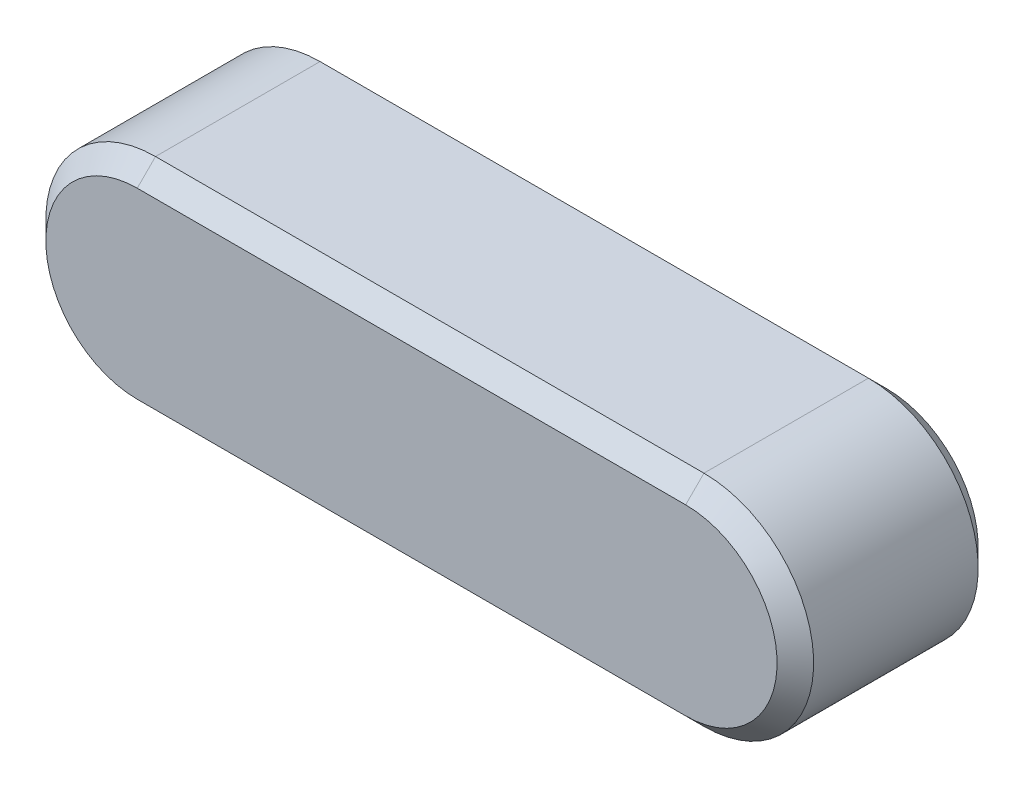
ISO-10303-21;
HEADER;
FILE_DESCRIPTION(('STEP AP214'),'2;1');
FILE_NAME('part.step','',(''),(''),'','','');
FILE_SCHEMA(('AUTOMOTIVE_DESIGN { 1 0 10303 214 1 1 1 1 }'));
ENDSEC;
DATA;
#1=APPLICATION_CONTEXT('core data for automotive mechanical design processes');
#2=APPLICATION_PROTOCOL_DEFINITION('international standard','automotive_design',2000,#1);
#3=PRODUCT_CONTEXT('',#1,'mechanical');
#4=PRODUCT('Part','Part','',(#3));
#5=PRODUCT_RELATED_PRODUCT_CATEGORY('part','',(#4));
#6=PRODUCT_DEFINITION_FORMATION('','',#4);
#7=PRODUCT_DEFINITION_CONTEXT('part definition',#1,'design');
#8=PRODUCT_DEFINITION('design','',#6,#7);
#9=PRODUCT_DEFINITION_SHAPE('','',#8);
#10=(LENGTH_UNIT() NAMED_UNIT(*) SI_UNIT(.MILLI.,.METRE.));
#11=(NAMED_UNIT(*) PLANE_ANGLE_UNIT() SI_UNIT($,.RADIAN.));
#12=(NAMED_UNIT(*) SI_UNIT($,.STERADIAN.) SOLID_ANGLE_UNIT());
#13=UNCERTAINTY_MEASURE_WITH_UNIT(LENGTH_MEASURE(1.E-05),#10,'distance_accuracy_value','');
#14=(GEOMETRIC_REPRESENTATION_CONTEXT(3) GLOBAL_UNCERTAINTY_ASSIGNED_CONTEXT((#13)) GLOBAL_UNIT_ASSIGNED_CONTEXT((#10,
#11,#12)) REPRESENTATION_CONTEXT('',''));
#15=CARTESIAN_POINT('',(0.,0.,0.));
#16=DIRECTION('',(0.,0.,1.));
#17=DIRECTION('',(1.,0.,0.));
#18=AXIS2_PLACEMENT_3D('',#15,#16,#17);
#19=CARTESIAN_POINT('',(7.5,0.,5.5));
#20=DIRECTION('',(0.,0.,-1.));
#21=DIRECTION('',(-1.,0.,0.));
#22=AXIS2_PLACEMENT_3D('',#19,#20,#21);
#23=CYLINDRICAL_SURFACE('',#22,3.);
#24=DIRECTION('',(0.,0.,-1.));
#25=VECTOR('',#24,1.);
#26=CARTESIAN_POINT('',(7.5,-3.,5.5));
#27=LINE('',#26,#25);
#28=CARTESIAN_POINT('',(7.5,-3.,5.));
#29=VERTEX_POINT('',#28);
#30=CARTESIAN_POINT('',(7.5,-3.,0.500000000000004));
#31=VERTEX_POINT('',#30);
#32=EDGE_CURVE('E113',#29,#31,#27,.T.);
#33=ORIENTED_EDGE('',*,*,#32,.T.);
#34=CARTESIAN_POINT('',(7.5,0.,0.500000000000004));
#35=DIRECTION('',(0.,0.,1.));
#36=DIRECTION('',(1.,0.,0.));
#37=AXIS2_PLACEMENT_3D('',#34,#35,#36);
#38=CIRCLE('',#37,3.);
#39=CARTESIAN_POINT('',(7.5,3.,0.500000000000004));
#40=VERTEX_POINT('',#39);
#41=EDGE_CURVE('E119',#31,#40,#38,.T.);
#42=ORIENTED_EDGE('',*,*,#41,.T.);
#43=DIRECTION('',(0.,0.,-1.));
#44=VECTOR('',#43,1.);
#45=CARTESIAN_POINT('',(7.5,3.,5.5));
#46=LINE('',#45,#44);
#47=CARTESIAN_POINT('',(7.5,3.,5.));
#48=VERTEX_POINT('',#47);
#49=EDGE_CURVE('E115',#48,#40,#46,.T.);
#50=ORIENTED_EDGE('',*,*,#49,.F.);
#51=CARTESIAN_POINT('',(7.5,0.,5.));
#52=DIRECTION('',(0.,0.,1.));
#53=DIRECTION('',(1.,0.,0.));
#54=AXIS2_PLACEMENT_3D('',#51,#52,#53);
#55=CIRCLE('',#54,3.);
#56=EDGE_CURVE('E111',#48,#29,#55,.F.);
#57=ORIENTED_EDGE('',*,*,#56,.T.);
#58=EDGE_LOOP('',(#33,#42,#50,#57));
#59=FACE_BOUND('',#58,.T.);
#60=ADVANCED_FACE('F41',(#59),#23,.T.);
#61=CARTESIAN_POINT('',(7.5,3.,5.5));
#62=DIRECTION('',(0.,-1.,0.));
#63=DIRECTION('',(1.,0.,0.));
#64=AXIS2_PLACEMENT_3D('',#61,#62,#63);
#65=PLANE('',#64);
#66=ORIENTED_EDGE('',*,*,#49,.T.);
#67=DIRECTION('',(-1.,0.,0.));
#68=VECTOR('',#67,1.);
#69=CARTESIAN_POINT('',(7.5,3.,0.500000000000004));
#70=LINE('',#69,#68);
#71=CARTESIAN_POINT('',(-7.5,3.,0.500000000000004));
#72=VERTEX_POINT('',#71);
#73=EDGE_CURVE('E175',#40,#72,#70,.T.);
#74=ORIENTED_EDGE('',*,*,#73,.T.);
#75=DIRECTION('',(0.,0.,-1.));
#76=VECTOR('',#75,1.);
#77=CARTESIAN_POINT('',(-7.5,3.,5.5));
#78=LINE('',#77,#76);
#79=CARTESIAN_POINT('',(-7.5,3.,5.));
#80=VERTEX_POINT('',#79);
#81=EDGE_CURVE('E203',#80,#72,#78,.T.);
#82=ORIENTED_EDGE('',*,*,#81,.F.);
#83=DIRECTION('',(1.,0.,0.));
#84=VECTOR('',#83,1.);
#85=CARTESIAN_POINT('',(7.5,3.,5.));
#86=LINE('',#85,#84);
#87=EDGE_CURVE('E189',#80,#48,#86,.T.);
#88=ORIENTED_EDGE('',*,*,#87,.T.);
#89=EDGE_LOOP('',(#66,#74,#82,#88));
#90=FACE_BOUND('',#89,.T.);
#91=ADVANCED_FACE('F205',(#90),#65,.F.);
#92=CARTESIAN_POINT('',(-7.5,0.,5.5));
#93=DIRECTION('',(0.,0.,-1.));
#94=DIRECTION('',(-1.,0.,0.));
#95=AXIS2_PLACEMENT_3D('',#92,#93,#94);
#96=CYLINDRICAL_SURFACE('',#95,3.);
#97=ORIENTED_EDGE('',*,*,#81,.T.);
#98=CARTESIAN_POINT('',(-7.5,0.,0.500000000000004));
#99=DIRECTION('',(0.,0.,1.));
#100=DIRECTION('',(1.,0.,0.));
#101=AXIS2_PLACEMENT_3D('',#98,#99,#100);
#102=CIRCLE('',#101,3.);
#103=CARTESIAN_POINT('',(-7.5,-3.,0.500000000000004));
#104=VERTEX_POINT('',#103);
#105=EDGE_CURVE('E170',#72,#104,#102,.T.);
#106=ORIENTED_EDGE('',*,*,#105,.T.);
#107=DIRECTION('',(0.,0.,-1.));
#108=VECTOR('',#107,1.);
#109=CARTESIAN_POINT('',(-7.5,-3.,5.5));
#110=LINE('',#109,#108);
#111=CARTESIAN_POINT('',(-7.5,-3.,5.));
#112=VERTEX_POINT('',#111);
#113=EDGE_CURVE('E131',#112,#104,#110,.T.);
#114=ORIENTED_EDGE('',*,*,#113,.F.);
#115=CARTESIAN_POINT('',(-7.5,0.,5.));
#116=DIRECTION('',(0.,0.,1.));
#117=DIRECTION('',(1.,0.,0.));
#118=AXIS2_PLACEMENT_3D('',#115,#116,#117);
#119=CIRCLE('',#118,3.);
#120=EDGE_CURVE('E186',#112,#80,#119,.F.);
#121=ORIENTED_EDGE('',*,*,#120,.T.);
#122=EDGE_LOOP('',(#97,#106,#114,#121));
#123=FACE_BOUND('',#122,.T.);
#124=ADVANCED_FACE('F202',(#123),#96,.T.);
#125=CARTESIAN_POINT('',(7.5,-3.,5.5));
#126=DIRECTION('',(0.,1.,0.));
#127=DIRECTION('',(-1.,0.,0.));
#128=AXIS2_PLACEMENT_3D('',#125,#126,#127);
#129=PLANE('',#128);
#130=ORIENTED_EDGE('',*,*,#113,.T.);
#131=DIRECTION('',(1.,0.,0.));
#132=VECTOR('',#131,1.);
#133=CARTESIAN_POINT('',(7.5,-3.,0.500000000000004));
#134=LINE('',#133,#132);
#135=EDGE_CURVE('E130',#104,#31,#134,.T.);
#136=ORIENTED_EDGE('',*,*,#135,.T.);
#137=ORIENTED_EDGE('',*,*,#32,.F.);
#138=DIRECTION('',(-1.,0.,0.));
#139=VECTOR('',#138,1.);
#140=CARTESIAN_POINT('',(-7.5,-3.,5.));
#141=LINE('',#140,#139);
#142=EDGE_CURVE('E127',#29,#112,#141,.T.);
#143=ORIENTED_EDGE('',*,*,#142,.T.);
#144=EDGE_LOOP('',(#130,#136,#137,#143));
#145=FACE_BOUND('',#144,.T.);
#146=ADVANCED_FACE('F126',(#145),#129,.F.);
#147=CARTESIAN_POINT('',(7.5,0.,5.5));
#148=DIRECTION('',(0.,0.,1.));
#149=DIRECTION('',(1.,0.,0.));
#150=AXIS2_PLACEMENT_3D('',#147,#148,#149);
#151=PLANE('',#150);
#152=CARTESIAN_POINT('',(-7.5,0.,5.5));
#153=DIRECTION('',(0.,0.,1.));
#154=DIRECTION('',(1.,0.,0.));
#155=AXIS2_PLACEMENT_3D('',#152,#153,#154);
#156=CIRCLE('',#155,2.5);
#157=CARTESIAN_POINT('',(-7.5,2.5,5.5));
#158=VERTEX_POINT('',#157);
#159=CARTESIAN_POINT('',(-7.5,-2.5,5.5));
#160=VERTEX_POINT('',#159);
#161=EDGE_CURVE('E65',#158,#160,#156,.T.);
#162=ORIENTED_EDGE('',*,*,#161,.T.);
#163=DIRECTION('',(1.,0.,0.));
#164=VECTOR('',#163,1.);
#165=CARTESIAN_POINT('',(7.5,-2.5,5.5));
#166=LINE('',#165,#164);
#167=CARTESIAN_POINT('',(7.5,-2.5,5.5));
#168=VERTEX_POINT('',#167);
#169=EDGE_CURVE('E11',#160,#168,#166,.T.);
#170=ORIENTED_EDGE('',*,*,#169,.T.);
#171=CARTESIAN_POINT('',(7.5,0.,5.5));
#172=DIRECTION('',(0.,0.,1.));
#173=DIRECTION('',(1.,0.,0.));
#174=AXIS2_PLACEMENT_3D('',#171,#172,#173);
#175=CIRCLE('',#174,2.5);
#176=CARTESIAN_POINT('',(7.5,2.5,5.5));
#177=VERTEX_POINT('',#176);
#178=EDGE_CURVE('E50',#168,#177,#175,.T.);
#179=ORIENTED_EDGE('',*,*,#178,.T.);
#180=DIRECTION('',(-1.,0.,0.));
#181=VECTOR('',#180,1.);
#182=CARTESIAN_POINT('',(-7.5,2.5,5.5));
#183=LINE('',#182,#181);
#184=EDGE_CURVE('E192',#177,#158,#183,.T.);
#185=ORIENTED_EDGE('',*,*,#184,.T.);
#186=EDGE_LOOP('',(#162,#170,#179,#185));
#187=FACE_BOUND('',#186,.T.);
#188=ADVANCED_FACE('F195',(#187),#151,.T.);
#189=CARTESIAN_POINT('',(7.5,0.,0.));
#190=DIRECTION('',(0.,0.,1.));
#191=DIRECTION('',(1.,0.,0.));
#192=AXIS2_PLACEMENT_3D('',#189,#190,#191);
#193=PLANE('',#192);
#194=CARTESIAN_POINT('',(7.5,0.,0.));
#195=DIRECTION('',(0.,0.,1.));
#196=DIRECTION('',(1.,0.,0.));
#197=AXIS2_PLACEMENT_3D('',#194,#195,#196);
#198=CIRCLE('',#197,2.5);
#199=CARTESIAN_POINT('',(7.5,2.5,0.));
#200=VERTEX_POINT('',#199);
#201=CARTESIAN_POINT('',(7.5,-2.49999999999999,0.));
#202=VERTEX_POINT('',#201);
#203=EDGE_CURVE('E179',#200,#202,#198,.F.);
#204=ORIENTED_EDGE('',*,*,#203,.T.);
#205=DIRECTION('',(-1.,0.,0.));
#206=VECTOR('',#205,1.);
#207=CARTESIAN_POINT('',(7.5,-2.49999999999999,0.));
#208=LINE('',#207,#206);
#209=CARTESIAN_POINT('',(-7.5,-2.5,0.));
#210=VERTEX_POINT('',#209);
#211=EDGE_CURVE('E120',#202,#210,#208,.T.);
#212=ORIENTED_EDGE('',*,*,#211,.T.);
#213=CARTESIAN_POINT('',(-7.5,0.,0.));
#214=DIRECTION('',(0.,0.,1.));
#215=DIRECTION('',(1.,0.,0.));
#216=AXIS2_PLACEMENT_3D('',#213,#214,#215);
#217=CIRCLE('',#216,2.5);
#218=CARTESIAN_POINT('',(-7.5,2.49999999999999,0.));
#219=VERTEX_POINT('',#218);
#220=EDGE_CURVE('E168',#210,#219,#217,.F.);
#221=ORIENTED_EDGE('',*,*,#220,.T.);
#222=DIRECTION('',(1.,0.,0.));
#223=VECTOR('',#222,1.);
#224=CARTESIAN_POINT('',(7.5,2.5,0.));
#225=LINE('',#224,#223);
#226=EDGE_CURVE('E176',#219,#200,#225,.T.);
#227=ORIENTED_EDGE('',*,*,#226,.T.);
#228=EDGE_LOOP('',(#204,#212,#221,#227));
#229=FACE_BOUND('',#228,.T.);
#230=ADVANCED_FACE('F229',(#229),#193,.F.);
#231=CARTESIAN_POINT('',(7.5,3.,0.500000000000004));
#232=DIRECTION('',(0.,-0.707106781186547,0.707106781186547));
#233=DIRECTION('',(-1.,0.,0.));
#234=AXIS2_PLACEMENT_3D('',#231,#232,#233);
#235=PLANE('',#234);
#236=DIRECTION('',(0.,0.707106781186547,0.707106781186547));
#237=VECTOR('',#236,1.);
#238=CARTESIAN_POINT('',(7.5,2.5,0.));
#239=LINE('',#238,#237);
#240=EDGE_CURVE('E154',#200,#40,#239,.T.);
#241=ORIENTED_EDGE('',*,*,#240,.F.);
#242=ORIENTED_EDGE('',*,*,#226,.F.);
#243=DIRECTION('',(0.,-0.707106781186547,-0.707106781186547));
#244=VECTOR('',#243,1.);
#245=CARTESIAN_POINT('',(-7.5,3.,0.500000000000004));
#246=LINE('',#245,#244);
#247=EDGE_CURVE('E132',#72,#219,#246,.T.);
#248=ORIENTED_EDGE('',*,*,#247,.F.);
#249=ORIENTED_EDGE('',*,*,#73,.F.);
#250=EDGE_LOOP('',(#241,#242,#248,#249));
#251=FACE_BOUND('',#250,.T.);
#252=ADVANCED_FACE('F174',(#251),#235,.F.);
#253=CARTESIAN_POINT('',(-7.5,0.,0.500000000000004));
#254=DIRECTION('',(0.,0.,1.));
#255=DIRECTION('',(1.,0.,0.));
#256=AXIS2_PLACEMENT_3D('',#253,#254,#255);
#257=CONICAL_SURFACE('',#256,3.,0.785398163397448);
#258=ORIENTED_EDGE('',*,*,#247,.T.);
#259=ORIENTED_EDGE('',*,*,#220,.F.);
#260=DIRECTION('',(0.,0.707106781186547,-0.707106781186547));
#261=VECTOR('',#260,1.);
#262=CARTESIAN_POINT('',(-7.5,-3.,0.500000000000004));
#263=LINE('',#262,#261);
#264=EDGE_CURVE('E148',#104,#210,#263,.T.);
#265=ORIENTED_EDGE('',*,*,#264,.F.);
#266=ORIENTED_EDGE('',*,*,#105,.F.);
#267=EDGE_LOOP('',(#258,#259,#265,#266));
#268=FACE_BOUND('',#267,.T.);
#269=ADVANCED_FACE('F166',(#268),#257,.T.);
#270=CARTESIAN_POINT('',(7.5,0.,0.500000000000004));
#271=DIRECTION('',(0.,0.,1.));
#272=DIRECTION('',(1.,0.,0.));
#273=AXIS2_PLACEMENT_3D('',#270,#271,#272);
#274=CONICAL_SURFACE('',#273,3.,0.785398163397448);
#275=ORIENTED_EDGE('',*,*,#240,.T.);
#276=ORIENTED_EDGE('',*,*,#41,.F.);
#277=DIRECTION('',(0.,-0.707106781186547,0.707106781186547));
#278=VECTOR('',#277,1.);
#279=CARTESIAN_POINT('',(7.5,-2.49999999999999,0.));
#280=LINE('',#279,#278);
#281=EDGE_CURVE('E145',#202,#31,#280,.T.);
#282=ORIENTED_EDGE('',*,*,#281,.F.);
#283=ORIENTED_EDGE('',*,*,#203,.F.);
#284=EDGE_LOOP('',(#275,#276,#282,#283));
#285=FACE_BOUND('',#284,.T.);
#286=ADVANCED_FACE('F211',(#285),#274,.T.);
#287=CARTESIAN_POINT('',(7.5,-3.,0.500000000000004));
#288=DIRECTION('',(0.,0.707106781186547,0.707106781186547));
#289=DIRECTION('',(1.,0.,0.));
#290=AXIS2_PLACEMENT_3D('',#287,#288,#289);
#291=PLANE('',#290);
#292=ORIENTED_EDGE('',*,*,#264,.T.);
#293=ORIENTED_EDGE('',*,*,#211,.F.);
#294=ORIENTED_EDGE('',*,*,#281,.T.);
#295=ORIENTED_EDGE('',*,*,#135,.F.);
#296=EDGE_LOOP('',(#292,#293,#294,#295));
#297=FACE_BOUND('',#296,.T.);
#298=ADVANCED_FACE('F209',(#297),#291,.F.);
#299=CARTESIAN_POINT('',(7.5,2.5,5.5));
#300=DIRECTION('',(0.,0.707106781186547,0.707106781186547));
#301=DIRECTION('',(1.,0.,0.));
#302=AXIS2_PLACEMENT_3D('',#299,#300,#301);
#303=PLANE('',#302);
#304=DIRECTION('',(0.,-0.707106781186547,0.707106781186547));
#305=VECTOR('',#304,1.);
#306=CARTESIAN_POINT('',(7.5,3.,5.));
#307=LINE('',#306,#305);
#308=EDGE_CURVE('E140',#48,#177,#307,.T.);
#309=ORIENTED_EDGE('',*,*,#308,.F.);
#310=ORIENTED_EDGE('',*,*,#87,.F.);
#311=DIRECTION('',(0.,0.707106781186547,-0.707106781186547));
#312=VECTOR('',#311,1.);
#313=CARTESIAN_POINT('',(-7.5,2.5,5.5));
#314=LINE('',#313,#312);
#315=EDGE_CURVE('E45',#158,#80,#314,.T.);
#316=ORIENTED_EDGE('',*,*,#315,.F.);
#317=ORIENTED_EDGE('',*,*,#184,.F.);
#318=EDGE_LOOP('',(#309,#310,#316,#317));
#319=FACE_BOUND('',#318,.T.);
#320=ADVANCED_FACE('F43',(#319),#303,.T.);
#321=CARTESIAN_POINT('',(-7.5,0.,5.5));
#322=DIRECTION('',(0.,0.,-1.));
#323=DIRECTION('',(-1.,0.,0.));
#324=AXIS2_PLACEMENT_3D('',#321,#322,#323);
#325=CONICAL_SURFACE('',#324,2.5,0.785398163397448);
#326=ORIENTED_EDGE('',*,*,#315,.T.);
#327=ORIENTED_EDGE('',*,*,#120,.F.);
#328=DIRECTION('',(0.,-0.707106781186547,-0.707106781186547));
#329=VECTOR('',#328,1.);
#330=CARTESIAN_POINT('',(-7.5,-2.5,5.5));
#331=LINE('',#330,#329);
#332=EDGE_CURVE('E135',#160,#112,#331,.T.);
#333=ORIENTED_EDGE('',*,*,#332,.F.);
#334=ORIENTED_EDGE('',*,*,#161,.F.);
#335=EDGE_LOOP('',(#326,#327,#333,#334));
#336=FACE_BOUND('',#335,.T.);
#337=ADVANCED_FACE('F198',(#336),#325,.T.);
#338=CARTESIAN_POINT('',(7.5,0.,5.5));
#339=DIRECTION('',(0.,0.,-1.));
#340=DIRECTION('',(-1.,0.,0.));
#341=AXIS2_PLACEMENT_3D('',#338,#339,#340);
#342=CONICAL_SURFACE('',#341,2.5,0.785398163397448);
#343=ORIENTED_EDGE('',*,*,#308,.T.);
#344=ORIENTED_EDGE('',*,*,#178,.F.);
#345=DIRECTION('',(0.,0.707106781186547,0.707106781186547));
#346=VECTOR('',#345,1.);
#347=CARTESIAN_POINT('',(7.5,-3.,5.));
#348=LINE('',#347,#346);
#349=EDGE_CURVE('E58',#29,#168,#348,.T.);
#350=ORIENTED_EDGE('',*,*,#349,.F.);
#351=ORIENTED_EDGE('',*,*,#56,.F.);
#352=EDGE_LOOP('',(#343,#344,#350,#351));
#353=FACE_BOUND('',#352,.T.);
#354=ADVANCED_FACE('F138',(#353),#342,.T.);
#355=CARTESIAN_POINT('',(7.5,-2.5,5.5));
#356=DIRECTION('',(0.,-0.707106781186547,0.707106781186547));
#357=DIRECTION('',(-1.,0.,0.));
#358=AXIS2_PLACEMENT_3D('',#355,#356,#357);
#359=PLANE('',#358);
#360=ORIENTED_EDGE('',*,*,#332,.T.);
#361=ORIENTED_EDGE('',*,*,#142,.F.);
#362=ORIENTED_EDGE('',*,*,#349,.T.);
#363=ORIENTED_EDGE('',*,*,#169,.F.);
#364=EDGE_LOOP('',(#360,#361,#362,#363));
#365=FACE_BOUND('',#364,.T.);
#366=ADVANCED_FACE('F134',(#365),#359,.T.);
#367=CLOSED_SHELL('',(#60,#91,#124,#146,#188,#230,#252,#269,#286,#298,#320,#337,#354,#366));
#368=MANIFOLD_SOLID_BREP('B2',#367);
#369=ADVANCED_BREP_SHAPE_REPRESENTATION('',(#18,#368),#14);
#370=SHAPE_DEFINITION_REPRESENTATION(#9,#369);
ENDSEC;
END-ISO-10303-21;
